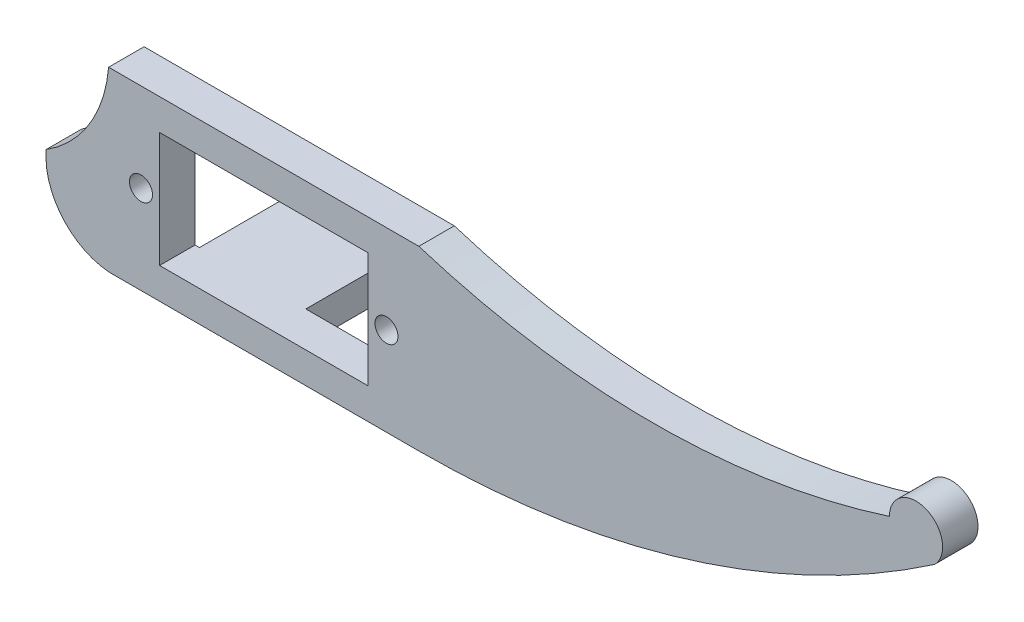
ISO-10303-21;
HEADER;
FILE_DESCRIPTION(('STEP AP214'),'2;1');
FILE_NAME('part.step','',(''),(''),'','','');
FILE_SCHEMA(('AUTOMOTIVE_DESIGN { 1 0 10303 214 1 1 1 1 }'));
ENDSEC;
DATA;
#1=APPLICATION_CONTEXT('core data for automotive mechanical design processes');
#2=APPLICATION_PROTOCOL_DEFINITION('international standard','automotive_design',2000,#1);
#3=PRODUCT_CONTEXT('',#1,'mechanical');
#4=PRODUCT('Part','Part','',(#3));
#5=PRODUCT_RELATED_PRODUCT_CATEGORY('part','',(#4));
#6=PRODUCT_DEFINITION_FORMATION('','',#4);
#7=PRODUCT_DEFINITION_CONTEXT('part definition',#1,'design');
#8=PRODUCT_DEFINITION('design','',#6,#7);
#9=PRODUCT_DEFINITION_SHAPE('','',#8);
#10=(LENGTH_UNIT() NAMED_UNIT(*) SI_UNIT(.MILLI.,.METRE.));
#11=(NAMED_UNIT(*) PLANE_ANGLE_UNIT() SI_UNIT($,.RADIAN.));
#12=(NAMED_UNIT(*) SI_UNIT($,.STERADIAN.) SOLID_ANGLE_UNIT());
#13=UNCERTAINTY_MEASURE_WITH_UNIT(LENGTH_MEASURE(1.E-05),#10,'distance_accuracy_value','');
#14=(GEOMETRIC_REPRESENTATION_CONTEXT(3) GLOBAL_UNCERTAINTY_ASSIGNED_CONTEXT((#13)) GLOBAL_UNIT_ASSIGNED_CONTEXT((#10,
#11,#12)) REPRESENTATION_CONTEXT('',''));
#15=CARTESIAN_POINT('',(0.,0.,0.));
#16=DIRECTION('',(0.,0.,1.));
#17=DIRECTION('',(1.,0.,0.));
#18=AXIS2_PLACEMENT_3D('',#15,#16,#17);
#19=CARTESIAN_POINT('',(0.,0.,0.));
#20=DIRECTION('',(0.,0.,1.));
#21=DIRECTION('',(1.,0.,0.));
#22=AXIS2_PLACEMENT_3D('',#19,#20,#21);
#23=PLANE('',#22);
#24=CARTESIAN_POINT('',(21.2104677769309,-2.6376373313008,0.));
#25=DIRECTION('',(0.,0.,1.));
#26=DIRECTION('',(1.,0.,0.));
#27=AXIS2_PLACEMENT_3D('',#24,#25,#26);
#28=CIRCLE('',#27,1.3);
#29=CARTESIAN_POINT('',(22.5104677769309,-2.6376373313008,0.));
#30=VERTEX_POINT('',#29);
#31=EDGE_CURVE('E282',#30,#30,#28,.T.);
#32=ORIENTED_EDGE('',*,*,#31,.T.);
#33=EDGE_LOOP('',(#32));
#34=FACE_BOUND('',#33,.T.);
#35=CARTESIAN_POINT('',(-6.48953222306909,-2.63763733130083,0.));
#36=DIRECTION('',(0.,0.,1.));
#37=DIRECTION('',(1.,0.,0.));
#38=AXIS2_PLACEMENT_3D('',#35,#36,#37);
#39=CIRCLE('',#38,1.3);
#40=CARTESIAN_POINT('',(-5.18953222306909,-2.63763733130083,0.));
#41=VERTEX_POINT('',#40);
#42=EDGE_CURVE('E290',#41,#41,#39,.T.);
#43=ORIENTED_EDGE('',*,*,#42,.T.);
#44=EDGE_LOOP('',(#43));
#45=FACE_BOUND('',#44,.T.);
#46=DIRECTION('',(0.,-1.,0.));
#47=VECTOR('',#46,1.);
#48=CARTESIAN_POINT('',(8.11046777693084,-9.1376373313008,0.));
#49=LINE('',#48,#47);
#50=CARTESIAN_POINT('',(8.11046777693084,-9.1376373313008,0.));
#51=VERTEX_POINT('',#50);
#52=CARTESIAN_POINT('',(8.11046777693084,-12.6376373313008,0.));
#53=VERTEX_POINT('',#52);
#54=EDGE_CURVE('E166',#51,#53,#49,.T.);
#55=ORIENTED_EDGE('',*,*,#54,.F.);
#56=DIRECTION('',(1.,0.,0.));
#57=VECTOR('',#56,1.);
#58=CARTESIAN_POINT('',(0.,-9.1376373313008,0.));
#59=LINE('',#58,#57);
#60=CARTESIAN_POINT('',(19.1104677769309,-9.1376373313008,0.));
#61=VERTEX_POINT('',#60);
#62=EDGE_CURVE('E209',#51,#61,#59,.T.);
#63=ORIENTED_EDGE('',*,*,#62,.T.);
#64=DIRECTION('',(0.,-1.,0.));
#65=VECTOR('',#64,1.);
#66=CARTESIAN_POINT('',(19.1104677769309,0.,0.));
#67=LINE('',#66,#65);
#68=CARTESIAN_POINT('',(19.1104677769309,3.8623626686992,0.));
#69=VERTEX_POINT('',#68);
#70=EDGE_CURVE('E170',#69,#61,#67,.T.);
#71=ORIENTED_EDGE('',*,*,#70,.F.);
#72=DIRECTION('',(1.,0.,0.));
#73=VECTOR('',#72,1.);
#74=CARTESIAN_POINT('',(0.,3.8623626686992,0.));
#75=LINE('',#74,#73);
#76=CARTESIAN_POINT('',(-4.38953222306909,3.8623626686992,0.));
#77=VERTEX_POINT('',#76);
#78=EDGE_CURVE('E167',#77,#69,#75,.T.);
#79=ORIENTED_EDGE('',*,*,#78,.F.);
#80=DIRECTION('',(0.,-1.,0.));
#81=VECTOR('',#80,1.);
#82=CARTESIAN_POINT('',(-4.38953222306909,0.,0.));
#83=LINE('',#82,#81);
#84=CARTESIAN_POINT('',(-4.38953222306909,-9.1376373313008,0.));
#85=VERTEX_POINT('',#84);
#86=EDGE_CURVE('E212',#77,#85,#83,.T.);
#87=ORIENTED_EDGE('',*,*,#86,.T.);
#88=CARTESIAN_POINT('',(-3.88953222306916,-9.1376373313008,0.));
#89=VERTEX_POINT('',#88);
#90=EDGE_CURVE('E210',#85,#89,#59,.T.);
#91=ORIENTED_EDGE('',*,*,#90,.T.);
#92=DIRECTION('',(0.,1.,0.));
#93=VECTOR('',#92,1.);
#94=CARTESIAN_POINT('',(-3.88953222306916,-9.1376373313008,0.));
#95=LINE('',#94,#93);
#96=CARTESIAN_POINT('',(-3.88953222306916,-12.6376373313008,0.));
#97=VERTEX_POINT('',#96);
#98=EDGE_CURVE('E60',#97,#89,#95,.T.);
#99=ORIENTED_EDGE('',*,*,#98,.F.);
#100=DIRECTION('',(1.,0.,0.));
#101=VECTOR('',#100,1.);
#102=CARTESIAN_POINT('',(0.,-12.6376373313008,0.));
#103=LINE('',#102,#101);
#104=CARTESIAN_POINT('',(-10.1395322230691,-12.6376373313008,0.));
#105=VERTEX_POINT('',#104);
#106=EDGE_CURVE('E215',#105,#97,#103,.T.);
#107=ORIENTED_EDGE('',*,*,#106,.F.);
#108=CARTESIAN_POINT('',(-9.43842758607949,-4.89787642197714,0.));
#109=DIRECTION('',(0.,0.,1.));
#110=DIRECTION('',(1.,0.,0.));
#111=AXIS2_PLACEMENT_3D('',#108,#109,#110);
#112=CIRCLE('',#111,7.77145074265435);
#113=CARTESIAN_POINT('',(-17.1781884954032,-4.19677178498755,0.));
#114=VERTEX_POINT('',#113);
#115=EDGE_CURVE('E180',#105,#114,#112,.F.);
#116=ORIENTED_EDGE('',*,*,#115,.T.);
#117=CARTESIAN_POINT('',(-25.2144187686787,8.61927416825423,0.));
#118=DIRECTION('',(0.,0.,1.));
#119=DIRECTION('',(1.,0.,0.));
#120=AXIS2_PLACEMENT_3D('',#117,#118,#119);
#121=CIRCLE('',#120,15.1271950764415);
#122=CARTESIAN_POINT('',(-10.1395322230691,7.3623626686992,0.));
#123=VERTEX_POINT('',#122);
#124=EDGE_CURVE('E228',#123,#114,#121,.F.);
#125=ORIENTED_EDGE('',*,*,#124,.F.);
#126=DIRECTION('',(1.,0.,0.));
#127=VECTOR('',#126,1.);
#128=CARTESIAN_POINT('',(0.,7.3623626686992,0.));
#129=LINE('',#128,#127);
#130=CARTESIAN_POINT('',(24.8604677769309,7.3623626686992,0.));
#131=VERTEX_POINT('',#130);
#132=EDGE_CURVE('E225',#123,#131,#129,.T.);
#133=ORIENTED_EDGE('',*,*,#132,.T.);
#134=CARTESIAN_POINT('',(51.1624750782054,90.5598698435227,0.));
#135=DIRECTION('',(0.,0.,1.));
#136=DIRECTION('',(1.,0.,0.));
#137=AXIS2_PLACEMENT_3D('',#134,#135,#136);
#138=CIRCLE('',#137,87.2560644779553);
#139=CARTESIAN_POINT('',(77.9569407255195,7.51965429192378,0.));
#140=VERTEX_POINT('',#139);
#141=EDGE_CURVE('E222',#131,#140,#138,.T.);
#142=ORIENTED_EDGE('',*,*,#141,.T.);
#143=CARTESIAN_POINT('',(80.9569407255194,7.51965429192378,0.));
#144=DIRECTION('',(0.,0.,1.));
#145=DIRECTION('',(1.,0.,0.));
#146=AXIS2_PLACEMENT_3D('',#143,#144,#145);
#147=CIRCLE('',#146,2.99999999999991);
#148=CARTESIAN_POINT('',(83.0359638887343,5.35686380581207,0.));
#149=VERTEX_POINT('',#148);
#150=EDGE_CURVE('E219',#149,#140,#147,.T.);
#151=ORIENTED_EDGE('',*,*,#150,.F.);
#152=CARTESIAN_POINT('',(24.8604677769309,90.3991290333978,0.));
#153=DIRECTION('',(0.,0.,1.));
#154=DIRECTION('',(1.,0.,0.));
#155=AXIS2_PLACEMENT_3D('',#152,#153,#154);
#156=CIRCLE('',#155,103.036766364699);
#157=CARTESIAN_POINT('',(24.8604677769309,-12.6376373313008,0.));
#158=VERTEX_POINT('',#157);
#159=EDGE_CURVE('E217',#158,#149,#156,.T.);
#160=ORIENTED_EDGE('',*,*,#159,.F.);
#161=EDGE_CURVE('E53',#53,#158,#103,.T.);
#162=ORIENTED_EDGE('',*,*,#161,.F.);
#163=EDGE_LOOP('',(#55,#63,#71,#79,#87,#91,#99,#107,#116,#125,#133,#142,#151,#160,#162));
#164=FACE_BOUND('',#163,.T.);
#165=ADVANCED_FACE('F36',(#34,#45,#164),#23,.F.);
#166=CARTESIAN_POINT('',(0.,-12.6376373313008,4.));
#167=DIRECTION('',(0.,1.,0.));
#168=DIRECTION('',(0.,0.,1.));
#169=AXIS2_PLACEMENT_3D('',#166,#167,#168);
#170=PLANE('',#169);
#171=ORIENTED_EDGE('',*,*,#106,.T.);
#172=DIRECTION('',(0.,0.,1.));
#173=VECTOR('',#172,1.);
#174=CARTESIAN_POINT('',(-3.88953222306916,-12.6376373313008,-12.));
#175=LINE('',#174,#173);
#176=CARTESIAN_POINT('',(-3.88953222306916,-12.6376373313008,-12.));
#177=VERTEX_POINT('',#176);
#178=EDGE_CURVE('E151',#177,#97,#175,.T.);
#179=ORIENTED_EDGE('',*,*,#178,.F.);
#180=DIRECTION('',(-1.,0.,0.));
#181=VECTOR('',#180,1.);
#182=CARTESIAN_POINT('',(8.11046777693084,-12.6376373313008,-12.));
#183=LINE('',#182,#181);
#184=CARTESIAN_POINT('',(8.11046777693084,-12.6376373313008,-12.));
#185=VERTEX_POINT('',#184);
#186=EDGE_CURVE('E144',#185,#177,#183,.T.);
#187=ORIENTED_EDGE('',*,*,#186,.F.);
#188=DIRECTION('',(0.,0.,1.));
#189=VECTOR('',#188,1.);
#190=CARTESIAN_POINT('',(8.11046777693084,-12.6376373313008,-12.));
#191=LINE('',#190,#189);
#192=EDGE_CURVE('E148',#185,#53,#191,.T.);
#193=ORIENTED_EDGE('',*,*,#192,.T.);
#194=ORIENTED_EDGE('',*,*,#161,.T.);
#195=DIRECTION('',(0.,0.,-1.));
#196=VECTOR('',#195,1.);
#197=CARTESIAN_POINT('',(24.8604677769309,-12.6376373313008,4.));
#198=LINE('',#197,#196);
#199=CARTESIAN_POINT('',(24.8604677769309,-12.6376373313008,4.));
#200=VERTEX_POINT('',#199);
#201=EDGE_CURVE('E11',#200,#158,#198,.T.);
#202=ORIENTED_EDGE('',*,*,#201,.F.);
#203=DIRECTION('',(1.,0.,0.));
#204=VECTOR('',#203,1.);
#205=CARTESIAN_POINT('',(0.,-12.6376373313008,4.));
#206=LINE('',#205,#204);
#207=CARTESIAN_POINT('',(-10.1395322230691,-12.6376373313008,4.));
#208=VERTEX_POINT('',#207);
#209=EDGE_CURVE('E188',#208,#200,#206,.T.);
#210=ORIENTED_EDGE('',*,*,#209,.F.);
#211=DIRECTION('',(0.,0.,-1.));
#212=VECTOR('',#211,1.);
#213=CARTESIAN_POINT('',(-10.1395322230691,-12.6376373313008,4.));
#214=LINE('',#213,#212);
#215=EDGE_CURVE('E233',#208,#105,#214,.T.);
#216=ORIENTED_EDGE('',*,*,#215,.T.);
#217=EDGE_LOOP('',(#171,#179,#187,#193,#194,#202,#210,#216));
#218=FACE_BOUND('',#217,.T.);
#219=ADVANCED_FACE('F146',(#218),#170,.F.);
#220=CARTESIAN_POINT('',(24.8604677769309,90.3991290333978,4.));
#221=DIRECTION('',(0.,0.,-1.));
#222=DIRECTION('',(-1.,0.,0.));
#223=AXIS2_PLACEMENT_3D('',#220,#221,#222);
#224=CYLINDRICAL_SURFACE('',#223,103.036766364699);
#225=ORIENTED_EDGE('',*,*,#159,.T.);
#226=DIRECTION('',(0.,0.,-1.));
#227=VECTOR('',#226,1.);
#228=CARTESIAN_POINT('',(83.0359638887343,5.35686380581207,4.));
#229=LINE('',#228,#227);
#230=CARTESIAN_POINT('',(83.0359638887343,5.35686380581207,4.));
#231=VERTEX_POINT('',#230);
#232=EDGE_CURVE('E45',#231,#149,#229,.T.);
#233=ORIENTED_EDGE('',*,*,#232,.F.);
#234=CARTESIAN_POINT('',(24.8604677769309,90.3991290333978,4.));
#235=DIRECTION('',(0.,0.,1.));
#236=DIRECTION('',(1.,0.,0.));
#237=AXIS2_PLACEMENT_3D('',#234,#235,#236);
#238=CIRCLE('',#237,103.036766364699);
#239=EDGE_CURVE('E191',#200,#231,#238,.T.);
#240=ORIENTED_EDGE('',*,*,#239,.F.);
#241=ORIENTED_EDGE('',*,*,#201,.T.);
#242=EDGE_LOOP('',(#225,#233,#240,#241));
#243=FACE_BOUND('',#242,.T.);
#244=ADVANCED_FACE('F324',(#243),#224,.T.);
#245=CARTESIAN_POINT('',(80.9569407255194,7.51965429192378,4.));
#246=DIRECTION('',(0.,0.,-1.));
#247=DIRECTION('',(-1.,0.,0.));
#248=AXIS2_PLACEMENT_3D('',#245,#246,#247);
#249=CYLINDRICAL_SURFACE('',#248,2.99999999999991);
#250=ORIENTED_EDGE('',*,*,#150,.T.);
#251=DIRECTION('',(0.,0.,-1.));
#252=VECTOR('',#251,1.);
#253=CARTESIAN_POINT('',(77.9569407255195,7.51965429192378,4.));
#254=LINE('',#253,#252);
#255=CARTESIAN_POINT('',(77.9569407255195,7.51965429192378,4.));
#256=VERTEX_POINT('',#255);
#257=EDGE_CURVE('E241',#256,#140,#254,.T.);
#258=ORIENTED_EDGE('',*,*,#257,.F.);
#259=CARTESIAN_POINT('',(80.9569407255194,7.51965429192378,4.));
#260=DIRECTION('',(0.,0.,1.));
#261=DIRECTION('',(1.,0.,0.));
#262=AXIS2_PLACEMENT_3D('',#259,#260,#261);
#263=CIRCLE('',#262,2.99999999999991);
#264=EDGE_CURVE('E193',#231,#256,#263,.T.);
#265=ORIENTED_EDGE('',*,*,#264,.F.);
#266=ORIENTED_EDGE('',*,*,#232,.T.);
#267=EDGE_LOOP('',(#250,#258,#265,#266));
#268=FACE_BOUND('',#267,.T.);
#269=ADVANCED_FACE('F329',(#268),#249,.T.);
#270=CARTESIAN_POINT('',(51.1624750782054,90.5598698435227,4.));
#271=DIRECTION('',(0.,0.,-1.));
#272=DIRECTION('',(-1.,0.,0.));
#273=AXIS2_PLACEMENT_3D('',#270,#271,#272);
#274=CYLINDRICAL_SURFACE('',#273,87.2560644779553);
#275=ORIENTED_EDGE('',*,*,#141,.F.);
#276=DIRECTION('',(0.,0.,-1.));
#277=VECTOR('',#276,1.);
#278=CARTESIAN_POINT('',(24.8604677769309,7.3623626686992,4.));
#279=LINE('',#278,#277);
#280=CARTESIAN_POINT('',(24.8604677769309,7.3623626686992,4.));
#281=VERTEX_POINT('',#280);
#282=EDGE_CURVE('E239',#281,#131,#279,.T.);
#283=ORIENTED_EDGE('',*,*,#282,.F.);
#284=CARTESIAN_POINT('',(51.1624750782054,90.5598698435227,4.));
#285=DIRECTION('',(0.,0.,1.));
#286=DIRECTION('',(1.,0.,0.));
#287=AXIS2_PLACEMENT_3D('',#284,#285,#286);
#288=CIRCLE('',#287,87.2560644779553);
#289=EDGE_CURVE('E195',#281,#256,#288,.T.);
#290=ORIENTED_EDGE('',*,*,#289,.T.);
#291=ORIENTED_EDGE('',*,*,#257,.T.);
#292=EDGE_LOOP('',(#275,#283,#290,#291));
#293=FACE_BOUND('',#292,.T.);
#294=ADVANCED_FACE('F344',(#293),#274,.F.);
#295=CARTESIAN_POINT('',(0.,7.3623626686992,4.));
#296=DIRECTION('',(0.,1.,0.));
#297=DIRECTION('',(0.,0.,1.));
#298=AXIS2_PLACEMENT_3D('',#295,#296,#297);
#299=PLANE('',#298);
#300=ORIENTED_EDGE('',*,*,#132,.F.);
#301=DIRECTION('',(0.,0.,-1.));
#302=VECTOR('',#301,1.);
#303=CARTESIAN_POINT('',(-10.1395322230691,7.3623626686992,4.));
#304=LINE('',#303,#302);
#305=CARTESIAN_POINT('',(-10.1395322230691,7.3623626686992,4.));
#306=VERTEX_POINT('',#305);
#307=EDGE_CURVE('E237',#306,#123,#304,.T.);
#308=ORIENTED_EDGE('',*,*,#307,.F.);
#309=DIRECTION('',(1.,0.,0.));
#310=VECTOR('',#309,1.);
#311=CARTESIAN_POINT('',(0.,7.3623626686992,4.));
#312=LINE('',#311,#310);
#313=EDGE_CURVE('E198',#306,#281,#312,.T.);
#314=ORIENTED_EDGE('',*,*,#313,.T.);
#315=ORIENTED_EDGE('',*,*,#282,.T.);
#316=EDGE_LOOP('',(#300,#308,#314,#315));
#317=FACE_BOUND('',#316,.T.);
#318=ADVANCED_FACE('F335',(#317),#299,.T.);
#319=CARTESIAN_POINT('',(-25.2144187686787,8.61927416825423,4.));
#320=DIRECTION('',(0.,0.,-1.));
#321=DIRECTION('',(-1.,0.,0.));
#322=AXIS2_PLACEMENT_3D('',#319,#320,#321);
#323=CYLINDRICAL_SURFACE('',#322,15.1271950764415);
#324=ORIENTED_EDGE('',*,*,#124,.T.);
#325=DIRECTION('',(0.,0.,-1.));
#326=VECTOR('',#325,1.);
#327=CARTESIAN_POINT('',(-17.1781884954032,-4.19677178498755,4.));
#328=LINE('',#327,#326);
#329=CARTESIAN_POINT('',(-17.1781884954032,-4.19677178498755,4.));
#330=VERTEX_POINT('',#329);
#331=EDGE_CURVE('E235',#330,#114,#328,.T.);
#332=ORIENTED_EDGE('',*,*,#331,.F.);
#333=CARTESIAN_POINT('',(-25.2144187686787,8.61927416825423,4.));
#334=DIRECTION('',(0.,0.,1.));
#335=DIRECTION('',(1.,0.,0.));
#336=AXIS2_PLACEMENT_3D('',#333,#334,#335);
#337=CIRCLE('',#336,15.1271950764415);
#338=EDGE_CURVE('E201',#306,#330,#337,.F.);
#339=ORIENTED_EDGE('',*,*,#338,.F.);
#340=ORIENTED_EDGE('',*,*,#307,.T.);
#341=EDGE_LOOP('',(#324,#332,#339,#340));
#342=FACE_BOUND('',#341,.T.);
#343=ADVANCED_FACE('F341',(#342),#323,.F.);
#344=CARTESIAN_POINT('',(0.,3.8623626686992,4.));
#345=DIRECTION('',(0.,1.,0.));
#346=DIRECTION('',(-1.,0.,0.));
#347=AXIS2_PLACEMENT_3D('',#344,#345,#346);
#348=PLANE('',#347);
#349=ORIENTED_EDGE('',*,*,#78,.T.);
#350=DIRECTION('',(0.,0.,-1.));
#351=VECTOR('',#350,1.);
#352=CARTESIAN_POINT('',(19.1104677769309,3.8623626686992,4.));
#353=LINE('',#352,#351);
#354=CARTESIAN_POINT('',(19.1104677769309,3.8623626686992,4.));
#355=VERTEX_POINT('',#354);
#356=EDGE_CURVE('E40',#355,#69,#353,.T.);
#357=ORIENTED_EDGE('',*,*,#356,.F.);
#358=DIRECTION('',(1.,0.,0.));
#359=VECTOR('',#358,1.);
#360=CARTESIAN_POINT('',(0.,3.8623626686992,4.));
#361=LINE('',#360,#359);
#362=CARTESIAN_POINT('',(-4.38953222306909,3.8623626686992,4.));
#363=VERTEX_POINT('',#362);
#364=EDGE_CURVE('E176',#363,#355,#361,.T.);
#365=ORIENTED_EDGE('',*,*,#364,.F.);
#366=DIRECTION('',(0.,0.,-1.));
#367=VECTOR('',#366,1.);
#368=CARTESIAN_POINT('',(-4.38953222306909,3.8623626686992,4.));
#369=LINE('',#368,#367);
#370=EDGE_CURVE('E205',#363,#77,#369,.T.);
#371=ORIENTED_EDGE('',*,*,#370,.T.);
#372=EDGE_LOOP('',(#349,#357,#365,#371));
#373=FACE_BOUND('',#372,.T.);
#374=ADVANCED_FACE('F38',(#373),#348,.F.);
#375=CARTESIAN_POINT('',(19.1104677769309,0.,4.));
#376=DIRECTION('',(1.,0.,0.));
#377=DIRECTION('',(0.,1.,0.));
#378=AXIS2_PLACEMENT_3D('',#375,#376,#377);
#379=PLANE('',#378);
#380=ORIENTED_EDGE('',*,*,#70,.T.);
#381=DIRECTION('',(0.,0.,-1.));
#382=VECTOR('',#381,1.);
#383=CARTESIAN_POINT('',(19.1104677769309,-9.1376373313008,4.));
#384=LINE('',#383,#382);
#385=CARTESIAN_POINT('',(19.1104677769309,-9.1376373313008,4.));
#386=VERTEX_POINT('',#385);
#387=EDGE_CURVE('E247',#386,#61,#384,.T.);
#388=ORIENTED_EDGE('',*,*,#387,.F.);
#389=DIRECTION('',(0.,-1.,0.));
#390=VECTOR('',#389,1.);
#391=CARTESIAN_POINT('',(19.1104677769309,0.,4.));
#392=LINE('',#391,#390);
#393=EDGE_CURVE('E179',#355,#386,#392,.T.);
#394=ORIENTED_EDGE('',*,*,#393,.F.);
#395=ORIENTED_EDGE('',*,*,#356,.T.);
#396=EDGE_LOOP('',(#380,#388,#394,#395));
#397=FACE_BOUND('',#396,.T.);
#398=ADVANCED_FACE('F255',(#397),#379,.F.);
#399=CARTESIAN_POINT('',(0.,-9.1376373313008,4.));
#400=DIRECTION('',(0.,1.,0.));
#401=DIRECTION('',(0.,0.,1.));
#402=AXIS2_PLACEMENT_3D('',#399,#400,#401);
#403=PLANE('',#402);
#404=ORIENTED_EDGE('',*,*,#90,.F.);
#405=DIRECTION('',(0.,0.,-1.));
#406=VECTOR('',#405,1.);
#407=CARTESIAN_POINT('',(-4.38953222306909,-9.1376373313008,4.));
#408=LINE('',#407,#406);
#409=CARTESIAN_POINT('',(-4.38953222306909,-9.1376373313008,4.));
#410=VERTEX_POINT('',#409);
#411=EDGE_CURVE('E246',#410,#85,#408,.T.);
#412=ORIENTED_EDGE('',*,*,#411,.F.);
#413=DIRECTION('',(1.,0.,0.));
#414=VECTOR('',#413,1.);
#415=CARTESIAN_POINT('',(0.,-9.1376373313008,4.));
#416=LINE('',#415,#414);
#417=EDGE_CURVE('E182',#410,#386,#416,.T.);
#418=ORIENTED_EDGE('',*,*,#417,.T.);
#419=ORIENTED_EDGE('',*,*,#387,.T.);
#420=ORIENTED_EDGE('',*,*,#62,.F.);
#421=DIRECTION('',(0.,0.,1.));
#422=VECTOR('',#421,1.);
#423=CARTESIAN_POINT('',(8.11046777693084,-9.1376373313008,-12.));
#424=LINE('',#423,#422);
#425=CARTESIAN_POINT('',(8.11046777693084,-9.1376373313008,-12.));
#426=VERTEX_POINT('',#425);
#427=EDGE_CURVE('E275',#426,#51,#424,.T.);
#428=ORIENTED_EDGE('',*,*,#427,.F.);
#429=DIRECTION('',(1.,0.,0.));
#430=VECTOR('',#429,1.);
#431=CARTESIAN_POINT('',(8.11046777693084,-9.1376373313008,-12.));
#432=LINE('',#431,#430);
#433=CARTESIAN_POINT('',(-3.88953222306916,-9.1376373313008,-12.));
#434=VERTEX_POINT('',#433);
#435=EDGE_CURVE('E160',#434,#426,#432,.T.);
#436=ORIENTED_EDGE('',*,*,#435,.F.);
#437=DIRECTION('',(0.,0.,1.));
#438=VECTOR('',#437,1.);
#439=CARTESIAN_POINT('',(-3.88953222306916,-9.1376373313008,-12.));
#440=LINE('',#439,#438);
#441=EDGE_CURVE('E172',#434,#89,#440,.T.);
#442=ORIENTED_EDGE('',*,*,#441,.T.);
#443=EDGE_LOOP('',(#404,#412,#418,#419,#420,#428,#436,#442));
#444=FACE_BOUND('',#443,.T.);
#445=ADVANCED_FACE('F266',(#444),#403,.T.);
#446=CARTESIAN_POINT('',(-4.38953222306909,0.,4.));
#447=DIRECTION('',(1.,0.,0.));
#448=DIRECTION('',(0.,1.,0.));
#449=AXIS2_PLACEMENT_3D('',#446,#447,#448);
#450=PLANE('',#449);
#451=ORIENTED_EDGE('',*,*,#86,.F.);
#452=ORIENTED_EDGE('',*,*,#370,.F.);
#453=DIRECTION('',(0.,-1.,0.));
#454=VECTOR('',#453,1.);
#455=CARTESIAN_POINT('',(-4.38953222306909,0.,4.));
#456=LINE('',#455,#454);
#457=EDGE_CURVE('E185',#363,#410,#456,.T.);
#458=ORIENTED_EDGE('',*,*,#457,.T.);
#459=ORIENTED_EDGE('',*,*,#411,.T.);
#460=EDGE_LOOP('',(#451,#452,#458,#459));
#461=FACE_BOUND('',#460,.T.);
#462=ADVANCED_FACE('F261',(#461),#450,.T.);
#463=CARTESIAN_POINT('',(-9.43842758607949,-4.89787642197714,4.));
#464=DIRECTION('',(0.,0.,-1.));
#465=DIRECTION('',(-1.,0.,0.));
#466=AXIS2_PLACEMENT_3D('',#463,#464,#465);
#467=CYLINDRICAL_SURFACE('',#466,7.77145074265435);
#468=ORIENTED_EDGE('',*,*,#115,.F.);
#469=ORIENTED_EDGE('',*,*,#215,.F.);
#470=CARTESIAN_POINT('',(-9.43842758607949,-4.89787642197714,4.));
#471=DIRECTION('',(0.,0.,1.));
#472=DIRECTION('',(1.,0.,0.));
#473=AXIS2_PLACEMENT_3D('',#470,#471,#472);
#474=CIRCLE('',#473,7.77145074265435);
#475=EDGE_CURVE('E203',#208,#330,#474,.F.);
#476=ORIENTED_EDGE('',*,*,#475,.T.);
#477=ORIENTED_EDGE('',*,*,#331,.T.);
#478=EDGE_LOOP('',(#468,#469,#476,#477));
#479=FACE_BOUND('',#478,.T.);
#480=ADVANCED_FACE('F314',(#479),#467,.T.);
#481=CARTESIAN_POINT('',(0.,0.,4.));
#482=DIRECTION('',(0.,0.,1.));
#483=DIRECTION('',(1.,0.,0.));
#484=AXIS2_PLACEMENT_3D('',#481,#482,#483);
#485=PLANE('',#484);
#486=CARTESIAN_POINT('',(21.2104677769309,-2.6376373313008,4.));
#487=DIRECTION('',(0.,0.,1.));
#488=DIRECTION('',(1.,0.,0.));
#489=AXIS2_PLACEMENT_3D('',#486,#487,#488);
#490=CIRCLE('',#489,1.3);
#491=CARTESIAN_POINT('',(22.5104677769309,-2.6376373313008,4.));
#492=VERTEX_POINT('',#491);
#493=EDGE_CURVE('E296',#492,#492,#490,.T.);
#494=ORIENTED_EDGE('',*,*,#493,.F.);
#495=EDGE_LOOP('',(#494));
#496=FACE_BOUND('',#495,.T.);
#497=CARTESIAN_POINT('',(-6.48953222306909,-2.63763733130083,4.));
#498=DIRECTION('',(0.,0.,1.));
#499=DIRECTION('',(1.,0.,0.));
#500=AXIS2_PLACEMENT_3D('',#497,#498,#499);
#501=CIRCLE('',#500,1.3);
#502=CARTESIAN_POINT('',(-5.18953222306909,-2.63763733130083,4.));
#503=VERTEX_POINT('',#502);
#504=EDGE_CURVE('E293',#503,#503,#501,.T.);
#505=ORIENTED_EDGE('',*,*,#504,.F.);
#506=EDGE_LOOP('',(#505));
#507=FACE_BOUND('',#506,.T.);
#508=ORIENTED_EDGE('',*,*,#364,.T.);
#509=ORIENTED_EDGE('',*,*,#393,.T.);
#510=ORIENTED_EDGE('',*,*,#417,.F.);
#511=ORIENTED_EDGE('',*,*,#457,.F.);
#512=EDGE_LOOP('',(#508,#509,#510,#511));
#513=FACE_BOUND('',#512,.T.);
#514=ORIENTED_EDGE('',*,*,#209,.T.);
#515=ORIENTED_EDGE('',*,*,#239,.T.);
#516=ORIENTED_EDGE('',*,*,#264,.T.);
#517=ORIENTED_EDGE('',*,*,#289,.F.);
#518=ORIENTED_EDGE('',*,*,#313,.F.);
#519=ORIENTED_EDGE('',*,*,#338,.T.);
#520=ORIENTED_EDGE('',*,*,#475,.F.);
#521=EDGE_LOOP('',(#514,#515,#516,#517,#518,#519,#520));
#522=FACE_BOUND('',#521,.T.);
#523=ADVANCED_FACE('F311',(#496,#507,#513,#522),#485,.T.);
#524=CARTESIAN_POINT('',(8.11046777693084,-9.1376373313008,-12.));
#525=DIRECTION('',(-1.,0.,0.));
#526=DIRECTION('',(0.,0.,1.));
#527=AXIS2_PLACEMENT_3D('',#524,#525,#526);
#528=PLANE('',#527);
#529=ORIENTED_EDGE('',*,*,#54,.T.);
#530=ORIENTED_EDGE('',*,*,#192,.F.);
#531=DIRECTION('',(0.,-1.,0.));
#532=VECTOR('',#531,1.);
#533=CARTESIAN_POINT('',(8.11046777693084,-9.1376373313008,-12.));
#534=LINE('',#533,#532);
#535=EDGE_CURVE('E155',#426,#185,#534,.T.);
#536=ORIENTED_EDGE('',*,*,#535,.F.);
#537=ORIENTED_EDGE('',*,*,#427,.T.);
#538=EDGE_LOOP('',(#529,#530,#536,#537));
#539=FACE_BOUND('',#538,.T.);
#540=ADVANCED_FACE('F165',(#539),#528,.F.);
#541=CARTESIAN_POINT('',(-3.88953222306916,-9.1376373313008,-12.));
#542=DIRECTION('',(1.,0.,0.));
#543=DIRECTION('',(0.,0.,-1.));
#544=AXIS2_PLACEMENT_3D('',#541,#542,#543);
#545=PLANE('',#544);
#546=ORIENTED_EDGE('',*,*,#98,.T.);
#547=ORIENTED_EDGE('',*,*,#441,.F.);
#548=DIRECTION('',(0.,1.,0.));
#549=VECTOR('',#548,1.);
#550=CARTESIAN_POINT('',(-3.88953222306916,-9.1376373313008,-12.));
#551=LINE('',#550,#549);
#552=EDGE_CURVE('E154',#177,#434,#551,.T.);
#553=ORIENTED_EDGE('',*,*,#552,.F.);
#554=ORIENTED_EDGE('',*,*,#178,.T.);
#555=EDGE_LOOP('',(#546,#547,#553,#554));
#556=FACE_BOUND('',#555,.T.);
#557=ADVANCED_FACE('F269',(#556),#545,.F.);
#558=CARTESIAN_POINT('',(0.,0.,-12.));
#559=DIRECTION('',(0.,0.,-1.));
#560=DIRECTION('',(-1.,0.,0.));
#561=AXIS2_PLACEMENT_3D('',#558,#559,#560);
#562=PLANE('',#561);
#563=CARTESIAN_POINT('',(-0.889532223069111,-10.8876373313009,-12.));
#564=DIRECTION('',(0.,0.,-1.));
#565=DIRECTION('',(-1.,0.,0.));
#566=AXIS2_PLACEMENT_3D('',#563,#564,#565);
#567=CIRCLE('',#566,0.80000000000006);
#568=CARTESIAN_POINT('',(-1.68953222306917,-10.8876373313009,-12.));
#569=VERTEX_POINT('',#568);
#570=EDGE_CURVE('E285',#569,#569,#567,.T.);
#571=ORIENTED_EDGE('',*,*,#570,.F.);
#572=EDGE_LOOP('',(#571));
#573=FACE_BOUND('',#572,.T.);
#574=CARTESIAN_POINT('',(5.11046777693089,-10.8876373313009,-12.));
#575=DIRECTION('',(0.,0.,-1.));
#576=DIRECTION('',(-1.,0.,0.));
#577=AXIS2_PLACEMENT_3D('',#574,#575,#576);
#578=CIRCLE('',#577,0.800000000000058);
#579=CARTESIAN_POINT('',(4.31046777693083,-10.8876373313009,-12.));
#580=VERTEX_POINT('',#579);
#581=EDGE_CURVE('E281',#580,#580,#578,.T.);
#582=ORIENTED_EDGE('',*,*,#581,.F.);
#583=EDGE_LOOP('',(#582));
#584=FACE_BOUND('',#583,.T.);
#585=ORIENTED_EDGE('',*,*,#535,.T.);
#586=ORIENTED_EDGE('',*,*,#186,.T.);
#587=ORIENTED_EDGE('',*,*,#552,.T.);
#588=ORIENTED_EDGE('',*,*,#435,.T.);
#589=EDGE_LOOP('',(#585,#586,#587,#588));
#590=FACE_BOUND('',#589,.T.);
#591=ADVANCED_FACE('F158',(#573,#584,#590),#562,.T.);
#592=CARTESIAN_POINT('',(5.11046777693089,-10.8876373313009,-9.));
#593=DIRECTION('',(0.,0.,-1.));
#594=DIRECTION('',(-1.,0.,0.));
#595=AXIS2_PLACEMENT_3D('',#592,#593,#594);
#596=CYLINDRICAL_SURFACE('',#595,0.800000000000058);
#597=CARTESIAN_POINT('',(5.11046777693089,-10.8876373313009,-9.));
#598=DIRECTION('',(0.,0.,-1.));
#599=DIRECTION('',(-1.,0.,0.));
#600=AXIS2_PLACEMENT_3D('',#597,#598,#599);
#601=CIRCLE('',#600,0.800000000000058);
#602=CARTESIAN_POINT('',(4.31046777693083,-10.8876373313009,-9.));
#603=VERTEX_POINT('',#602);
#604=EDGE_CURVE('E278',#603,#603,#601,.T.);
#605=ORIENTED_EDGE('',*,*,#604,.F.);
#606=EDGE_LOOP('',(#605));
#607=FACE_BOUND('',#606,.T.);
#608=ORIENTED_EDGE('',*,*,#581,.T.);
#609=EDGE_LOOP('',(#608));
#610=FACE_BOUND('',#609,.T.);
#611=ADVANCED_FACE('F468',(#607,#610),#596,.F.);
#612=CARTESIAN_POINT('',(5.11046777693089,-10.8876373313009,-9.));
#613=DIRECTION('',(0.,0.,-1.));
#614=DIRECTION('',(-1.,0.,0.));
#615=AXIS2_PLACEMENT_3D('',#612,#613,#614);
#616=PLANE('',#615);
#617=ORIENTED_EDGE('',*,*,#604,.T.);
#618=EDGE_LOOP('',(#617));
#619=FACE_BOUND('',#618,.T.);
#620=ADVANCED_FACE('F479',(#619),#616,.T.);
#621=CARTESIAN_POINT('',(-0.889532223069111,-10.8876373313009,-9.));
#622=DIRECTION('',(0.,0.,-1.));
#623=DIRECTION('',(-1.,0.,0.));
#624=AXIS2_PLACEMENT_3D('',#621,#622,#623);
#625=CYLINDRICAL_SURFACE('',#624,0.80000000000006);
#626=CARTESIAN_POINT('',(-0.889532223069111,-10.8876373313009,-9.));
#627=DIRECTION('',(0.,0.,-1.));
#628=DIRECTION('',(-1.,0.,0.));
#629=AXIS2_PLACEMENT_3D('',#626,#627,#628);
#630=CIRCLE('',#629,0.80000000000006);
#631=CARTESIAN_POINT('',(-1.68953222306917,-10.8876373313009,-9.));
#632=VERTEX_POINT('',#631);
#633=EDGE_CURVE('E271',#632,#632,#630,.T.);
#634=ORIENTED_EDGE('',*,*,#633,.F.);
#635=EDGE_LOOP('',(#634));
#636=FACE_BOUND('',#635,.T.);
#637=ORIENTED_EDGE('',*,*,#570,.T.);
#638=EDGE_LOOP('',(#637));
#639=FACE_BOUND('',#638,.T.);
#640=ADVANCED_FACE('F490',(#636,#639),#625,.F.);
#641=CARTESIAN_POINT('',(-0.889532223069111,-10.8876373313009,-9.));
#642=DIRECTION('',(0.,0.,-1.));
#643=DIRECTION('',(-1.,0.,0.));
#644=AXIS2_PLACEMENT_3D('',#641,#642,#643);
#645=PLANE('',#644);
#646=ORIENTED_EDGE('',*,*,#633,.T.);
#647=EDGE_LOOP('',(#646));
#648=FACE_BOUND('',#647,.T.);
#649=ADVANCED_FACE('F501',(#648),#645,.T.);
#650=CARTESIAN_POINT('',(-6.48953222306909,-2.63763733130083,0.));
#651=DIRECTION('',(0.,0.,1.));
#652=DIRECTION('',(1.,0.,0.));
#653=AXIS2_PLACEMENT_3D('',#650,#651,#652);
#654=CYLINDRICAL_SURFACE('',#653,1.3);
#655=ORIENTED_EDGE('',*,*,#42,.F.);
#656=EDGE_LOOP('',(#655));
#657=FACE_BOUND('',#656,.T.);
#658=ORIENTED_EDGE('',*,*,#504,.T.);
#659=EDGE_LOOP('',(#658));
#660=FACE_BOUND('',#659,.T.);
#661=ADVANCED_FACE('F307',(#657,#660),#654,.F.);
#662=CARTESIAN_POINT('',(21.2104677769309,-2.6376373313008,0.));
#663=DIRECTION('',(0.,0.,1.));
#664=DIRECTION('',(1.,0.,0.));
#665=AXIS2_PLACEMENT_3D('',#662,#663,#664);
#666=CYLINDRICAL_SURFACE('',#665,1.3);
#667=ORIENTED_EDGE('',*,*,#31,.F.);
#668=EDGE_LOOP('',(#667));
#669=FACE_BOUND('',#668,.T.);
#670=ORIENTED_EDGE('',*,*,#493,.T.);
#671=EDGE_LOOP('',(#670));
#672=FACE_BOUND('',#671,.T.);
#673=ADVANCED_FACE('F304',(#669,#672),#666,.F.);
#674=CLOSED_SHELL('',(#165,#219,#244,#269,#294,#318,#343,#374,#398,#445,#462,#480,#523,#540,
#557,#591,#611,#620,#640,#649,#661,#673));
#675=MANIFOLD_SOLID_BREP('B2',#674);
#676=ADVANCED_BREP_SHAPE_REPRESENTATION('',(#18,#675),#14);
#677=SHAPE_DEFINITION_REPRESENTATION(#9,#676);
ENDSEC;
END-ISO-10303-21;
